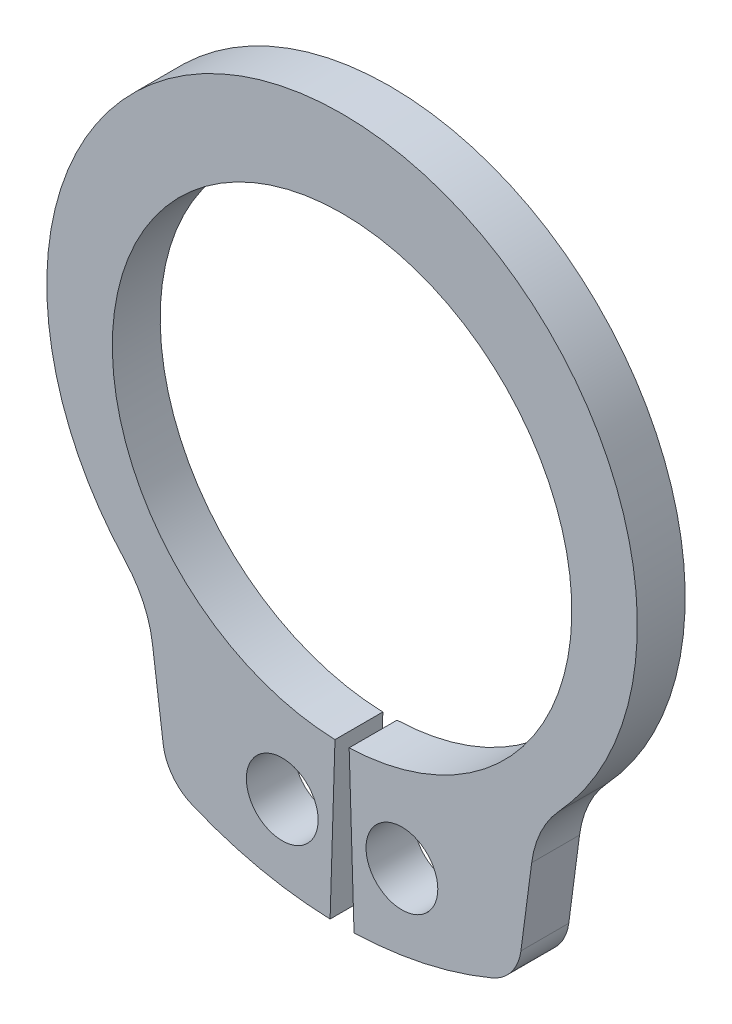
ISO-10303-21;
HEADER;
FILE_DESCRIPTION(('STEP AP214'),'2;1');
FILE_NAME('part.step','',(''),(''),'','','');
FILE_SCHEMA(('AUTOMOTIVE_DESIGN { 1 0 10303 214 1 1 1 1 }'));
ENDSEC;
DATA;
#1=APPLICATION_CONTEXT('core data for automotive mechanical design processes');
#2=APPLICATION_PROTOCOL_DEFINITION('international standard','automotive_design',2000,#1);
#3=PRODUCT_CONTEXT('',#1,'mechanical');
#4=PRODUCT('Part','Part','',(#3));
#5=PRODUCT_RELATED_PRODUCT_CATEGORY('part','',(#4));
#6=PRODUCT_DEFINITION_FORMATION('','',#4);
#7=PRODUCT_DEFINITION_CONTEXT('part definition',#1,'design');
#8=PRODUCT_DEFINITION('design','',#6,#7);
#9=PRODUCT_DEFINITION_SHAPE('','',#8);
#10=(LENGTH_UNIT() NAMED_UNIT(*) SI_UNIT(.MILLI.,.METRE.));
#11=(NAMED_UNIT(*) PLANE_ANGLE_UNIT() SI_UNIT($,.RADIAN.));
#12=(NAMED_UNIT(*) SI_UNIT($,.STERADIAN.) SOLID_ANGLE_UNIT());
#13=UNCERTAINTY_MEASURE_WITH_UNIT(LENGTH_MEASURE(1.E-05),#10,'distance_accuracy_value','');
#14=(GEOMETRIC_REPRESENTATION_CONTEXT(3) GLOBAL_UNCERTAINTY_ASSIGNED_CONTEXT((#13)) GLOBAL_UNIT_ASSIGNED_CONTEXT((#10,
#11,#12)) REPRESENTATION_CONTEXT('',''));
#15=CARTESIAN_POINT('',(0.,0.,0.));
#16=DIRECTION('',(0.,0.,1.));
#17=DIRECTION('',(1.,0.,0.));
#18=AXIS2_PLACEMENT_3D('',#15,#16,#17);
#19=CARTESIAN_POINT('',(0.,0.,-1.));
#20=DIRECTION('',(0.,0.,1.));
#21=DIRECTION('',(1.,0.,0.));
#22=AXIS2_PLACEMENT_3D('',#19,#20,#21);
#23=CYLINDRICAL_SURFACE('',#22,4.8);
#24=CARTESIAN_POINT('',(0.,0.,0.));
#25=DIRECTION('',(0.,0.,-1.));
#26=DIRECTION('',(1.,0.,0.));
#27=AXIS2_PLACEMENT_3D('',#24,#25,#26);
#28=CIRCLE('',#27,4.8);
#29=CARTESIAN_POINT('',(-0.148148148148148,-4.79771321841982,0.));
#30=VERTEX_POINT('',#29);
#31=CARTESIAN_POINT('',(0.148148148148148,-4.79771321841982,0.));
#32=VERTEX_POINT('',#31);
#33=EDGE_CURVE('E153',#30,#32,#28,.T.);
#34=ORIENTED_EDGE('',*,*,#33,.F.);
#35=DIRECTION('',(0.,0.,1.));
#36=VECTOR('',#35,1.);
#37=CARTESIAN_POINT('',(-0.148148148148148,-4.79771321841982,-1.));
#38=LINE('',#37,#36);
#39=CARTESIAN_POINT('',(-0.148148148148148,-4.79771321841982,-1.));
#40=VERTEX_POINT('',#39);
#41=EDGE_CURVE('E11',#40,#30,#38,.T.);
#42=ORIENTED_EDGE('',*,*,#41,.F.);
#43=CARTESIAN_POINT('',(0.,0.,-1.));
#44=DIRECTION('',(0.,0.,-1.));
#45=DIRECTION('',(1.,0.,0.));
#46=AXIS2_PLACEMENT_3D('',#43,#44,#45);
#47=CIRCLE('',#46,4.8);
#48=CARTESIAN_POINT('',(0.148148148148148,-4.79771321841982,-1.));
#49=VERTEX_POINT('',#48);
#50=EDGE_CURVE('E186',#40,#49,#47,.T.);
#51=ORIENTED_EDGE('',*,*,#50,.T.);
#52=DIRECTION('',(0.,0.,1.));
#53=VECTOR('',#52,1.);
#54=CARTESIAN_POINT('',(0.148148148148148,-4.79771321841982,-1.));
#55=LINE('',#54,#53);
#56=EDGE_CURVE('E35',#49,#32,#55,.T.);
#57=ORIENTED_EDGE('',*,*,#56,.T.);
#58=EDGE_LOOP('',(#34,#42,#51,#57));
#59=FACE_BOUND('',#58,.T.);
#60=ADVANCED_FACE('F32',(#59),#23,.F.);
#61=CARTESIAN_POINT('',(-0.148148148148148,-4.79771321841982,-1.));
#62=DIRECTION('',(0.999523587170796,-0.0308641975308642,0.));
#63=DIRECTION('',(0.0308641975308642,0.999523587170796,0.));
#64=AXIS2_PLACEMENT_3D('',#61,#62,#63);
#65=PLANE('',#64);
#66=DIRECTION('',(0.0308641975308642,0.999523587170796,0.));
#67=VECTOR('',#66,1.);
#68=CARTESIAN_POINT('',(-0.148148148148148,-4.79771321841982,0.));
#69=LINE('',#68,#67);
#70=CARTESIAN_POINT('',(-0.25,-8.09614105608345,0.));
#71=VERTEX_POINT('',#70);
#72=EDGE_CURVE('E184',#71,#30,#69,.T.);
#73=ORIENTED_EDGE('',*,*,#72,.F.);
#74=DIRECTION('',(0.,0.,1.));
#75=VECTOR('',#74,1.);
#76=CARTESIAN_POINT('',(-0.25,-8.09614105608345,-1.));
#77=LINE('',#76,#75);
#78=CARTESIAN_POINT('',(-0.25,-8.09614105608345,-1.));
#79=VERTEX_POINT('',#78);
#80=EDGE_CURVE('E41',#79,#71,#77,.T.);
#81=ORIENTED_EDGE('',*,*,#80,.F.);
#82=DIRECTION('',(0.0308641975308642,0.999523587170796,0.));
#83=VECTOR('',#82,1.);
#84=CARTESIAN_POINT('',(-0.148148148148148,-4.79771321841982,-1.));
#85=LINE('',#84,#83);
#86=EDGE_CURVE('E143',#79,#40,#85,.T.);
#87=ORIENTED_EDGE('',*,*,#86,.T.);
#88=ORIENTED_EDGE('',*,*,#41,.T.);
#89=EDGE_LOOP('',(#73,#81,#87,#88));
#90=FACE_BOUND('',#89,.T.);
#91=ADVANCED_FACE('F206',(#90),#65,.T.);
#92=CARTESIAN_POINT('',(0.,0.,-1.));
#93=DIRECTION('',(0.,0.,1.));
#94=DIRECTION('',(1.,0.,0.));
#95=AXIS2_PLACEMENT_3D('',#92,#93,#94);
#96=CYLINDRICAL_SURFACE('',#95,8.1);
#97=CARTESIAN_POINT('',(0.,0.,0.));
#98=DIRECTION('',(0.,0.,1.));
#99=DIRECTION('',(1.,0.,0.));
#100=AXIS2_PLACEMENT_3D('',#97,#98,#99);
#101=CIRCLE('',#100,8.1);
#102=CARTESIAN_POINT('',(-3.13158644156997,-7.47015169584762,0.));
#103=VERTEX_POINT('',#102);
#104=EDGE_CURVE('E130',#103,#71,#101,.T.);
#105=ORIENTED_EDGE('',*,*,#104,.F.);
#106=DIRECTION('',(0.,0.,1.));
#107=VECTOR('',#106,1.);
#108=CARTESIAN_POINT('',(-3.13158644156997,-7.47015169584762,-1.));
#109=LINE('',#108,#107);
#110=CARTESIAN_POINT('',(-3.13158644156997,-7.47015169584762,-1.));
#111=VERTEX_POINT('',#110);
#112=EDGE_CURVE('E125',#111,#103,#109,.T.);
#113=ORIENTED_EDGE('',*,*,#112,.F.);
#114=CARTESIAN_POINT('',(0.,0.,-1.));
#115=DIRECTION('',(0.,0.,1.));
#116=DIRECTION('',(1.,0.,0.));
#117=AXIS2_PLACEMENT_3D('',#114,#115,#116);
#118=CIRCLE('',#117,8.1);
#119=EDGE_CURVE('E128',#111,#79,#118,.T.);
#120=ORIENTED_EDGE('',*,*,#119,.T.);
#121=ORIENTED_EDGE('',*,*,#80,.T.);
#122=EDGE_LOOP('',(#105,#113,#120,#121));
#123=FACE_BOUND('',#122,.T.);
#124=ADVANCED_FACE('F127',(#123),#96,.T.);
#125=CARTESIAN_POINT('',(-2.7449708314996,-6.54791074574298,-1.));
#126=DIRECTION('',(0.,0.,1.));
#127=DIRECTION('',(1.,0.,0.));
#128=AXIS2_PLACEMENT_3D('',#125,#126,#127);
#129=CYLINDRICAL_SURFACE('',#128,1.);
#130=CARTESIAN_POINT('',(-2.7449708314996,-6.54791074574298,0.));
#131=DIRECTION('',(0.,0.,1.));
#132=DIRECTION('',(1.,0.,0.));
#133=AXIS2_PLACEMENT_3D('',#130,#131,#132);
#134=CIRCLE('',#133,1.);
#135=CARTESIAN_POINT('',(-3.73641569287341,-6.67843693796303,0.));
#136=VERTEX_POINT('',#135);
#137=EDGE_CURVE('E181',#136,#103,#134,.T.);
#138=ORIENTED_EDGE('',*,*,#137,.F.);
#139=DIRECTION('',(0.,0.,1.));
#140=VECTOR('',#139,1.);
#141=CARTESIAN_POINT('',(-3.73641569287341,-6.67843693796303,-1.));
#142=LINE('',#141,#140);
#143=CARTESIAN_POINT('',(-3.73641569287341,-6.67843693796303,-1.));
#144=VERTEX_POINT('',#143);
#145=EDGE_CURVE('E135',#144,#136,#142,.T.);
#146=ORIENTED_EDGE('',*,*,#145,.F.);
#147=CARTESIAN_POINT('',(-2.7449708314996,-6.54791074574298,-1.));
#148=DIRECTION('',(0.,0.,1.));
#149=DIRECTION('',(1.,0.,0.));
#150=AXIS2_PLACEMENT_3D('',#147,#148,#149);
#151=CIRCLE('',#150,1.);
#152=EDGE_CURVE('E141',#144,#111,#151,.T.);
#153=ORIENTED_EDGE('',*,*,#152,.T.);
#154=ORIENTED_EDGE('',*,*,#112,.T.);
#155=EDGE_LOOP('',(#138,#146,#153,#154));
#156=FACE_BOUND('',#155,.T.);
#157=ADVANCED_FACE('F145',(#156),#129,.T.);
#158=CARTESIAN_POINT('',(-3.96130985704623,-4.97019616551948,-1.));
#159=DIRECTION('',(-0.99144486137381,-0.130526192220051,0.));
#160=DIRECTION('',(0.130526192220051,-0.991444861373811,0.));
#161=AXIS2_PLACEMENT_3D('',#158,#159,#160);
#162=PLANE('',#161);
#163=DIRECTION('',(0.130526192220051,-0.99144486137381,0.));
#164=VECTOR('',#163,1.);
#165=CARTESIAN_POINT('',(-3.96130985704623,-4.97019616551948,0.));
#166=LINE('',#165,#164);
#167=CARTESIAN_POINT('',(-3.96130985704623,-4.97019616551948,0.));
#168=VERTEX_POINT('',#167);
#169=EDGE_CURVE('E178',#168,#136,#166,.T.);
#170=ORIENTED_EDGE('',*,*,#169,.F.);
#171=DIRECTION('',(0.,0.,1.));
#172=VECTOR('',#171,1.);
#173=CARTESIAN_POINT('',(-3.96130985704623,-4.97019616551948,-1.));
#174=LINE('',#173,#172);
#175=CARTESIAN_POINT('',(-3.96130985704623,-4.97019616551948,-1.));
#176=VERTEX_POINT('',#175);
#177=EDGE_CURVE('E190',#176,#168,#174,.T.);
#178=ORIENTED_EDGE('',*,*,#177,.F.);
#179=DIRECTION('',(0.130526192220051,-0.99144486137381,0.));
#180=VECTOR('',#179,1.);
#181=CARTESIAN_POINT('',(-3.96130985704623,-4.97019616551948,-1.));
#182=LINE('',#181,#180);
#183=EDGE_CURVE('E146',#176,#144,#182,.T.);
#184=ORIENTED_EDGE('',*,*,#183,.T.);
#185=ORIENTED_EDGE('',*,*,#145,.T.);
#186=EDGE_LOOP('',(#170,#178,#184,#185));
#187=FACE_BOUND('',#186,.T.);
#188=ADVANCED_FACE('F219',(#187),#162,.T.);
#189=CARTESIAN_POINT('',(-6.16002808843545,-5.25966291217282,-1.));
#190=DIRECTION('',(0.,0.,1.));
#191=DIRECTION('',(1.,0.,0.));
#192=AXIS2_PLACEMENT_3D('',#189,#190,#191);
#193=CYLINDRICAL_SURFACE('',#192,2.21769088433475);
#194=CARTESIAN_POINT('',(-6.16002808843545,-5.25966291217282,0.));
#195=DIRECTION('',(0.,0.,-1.));
#196=DIRECTION('',(1.,0.,0.));
#197=AXIS2_PLACEMENT_3D('',#194,#195,#196);
#198=CIRCLE('',#197,2.21769088433475);
#199=CARTESIAN_POINT('',(-4.53108492684802,-3.75477187466246,0.));
#200=VERTEX_POINT('',#199);
#201=EDGE_CURVE('E175',#200,#168,#198,.T.);
#202=ORIENTED_EDGE('',*,*,#201,.F.);
#203=DIRECTION('',(0.,0.,1.));
#204=VECTOR('',#203,1.);
#205=CARTESIAN_POINT('',(-4.53108492684802,-3.75477187466246,-1.));
#206=LINE('',#205,#204);
#207=CARTESIAN_POINT('',(-4.53108492684802,-3.75477187466246,-1.));
#208=VERTEX_POINT('',#207);
#209=EDGE_CURVE('E192',#208,#200,#206,.T.);
#210=ORIENTED_EDGE('',*,*,#209,.F.);
#211=CARTESIAN_POINT('',(-6.16002808843545,-5.25966291217282,-1.));
#212=DIRECTION('',(0.,0.,-1.));
#213=DIRECTION('',(1.,0.,0.));
#214=AXIS2_PLACEMENT_3D('',#211,#212,#213);
#215=CIRCLE('',#214,2.21769088433475);
#216=EDGE_CURVE('E148',#208,#176,#215,.T.);
#217=ORIENTED_EDGE('',*,*,#216,.T.);
#218=ORIENTED_EDGE('',*,*,#177,.T.);
#219=EDGE_LOOP('',(#202,#210,#217,#218));
#220=FACE_BOUND('',#219,.T.);
#221=ADVANCED_FACE('F222',(#220),#193,.F.);
#222=CARTESIAN_POINT('',(0.,0.431248397503952,-1.));
#223=DIRECTION('',(0.,0.,1.));
#224=DIRECTION('',(1.,0.,0.));
#225=AXIS2_PLACEMENT_3D('',#222,#223,#224);
#226=CYLINDRICAL_SURFACE('',#225,6.16875160249605);
#227=CARTESIAN_POINT('',(0.,0.431248397503952,0.));
#228=DIRECTION('',(0.,0.,1.));
#229=DIRECTION('',(1.,0.,0.));
#230=AXIS2_PLACEMENT_3D('',#227,#228,#229);
#231=CIRCLE('',#230,6.16875160249605);
#232=CARTESIAN_POINT('',(4.53108492684802,-3.75477187466247,0.));
#233=VERTEX_POINT('',#232);
#234=EDGE_CURVE('E172',#233,#200,#231,.T.);
#235=ORIENTED_EDGE('',*,*,#234,.F.);
#236=DIRECTION('',(0.,0.,1.));
#237=VECTOR('',#236,1.);
#238=CARTESIAN_POINT('',(4.53108492684802,-3.75477187466247,-1.));
#239=LINE('',#238,#237);
#240=CARTESIAN_POINT('',(4.53108492684802,-3.75477187466247,-1.));
#241=VERTEX_POINT('',#240);
#242=EDGE_CURVE('E194',#241,#233,#239,.T.);
#243=ORIENTED_EDGE('',*,*,#242,.F.);
#244=CARTESIAN_POINT('',(0.,0.431248397503952,-1.));
#245=DIRECTION('',(0.,0.,1.));
#246=DIRECTION('',(1.,0.,0.));
#247=AXIS2_PLACEMENT_3D('',#244,#245,#246);
#248=CIRCLE('',#247,6.16875160249605);
#249=EDGE_CURVE('E296',#241,#208,#248,.T.);
#250=ORIENTED_EDGE('',*,*,#249,.T.);
#251=ORIENTED_EDGE('',*,*,#209,.T.);
#252=EDGE_LOOP('',(#235,#243,#250,#251));
#253=FACE_BOUND('',#252,.T.);
#254=ADVANCED_FACE('F226',(#253),#226,.T.);
#255=CARTESIAN_POINT('',(6.16002808843545,-5.25966291217282,-1.));
#256=DIRECTION('',(0.,0.,1.));
#257=DIRECTION('',(1.,0.,0.));
#258=AXIS2_PLACEMENT_3D('',#255,#256,#257);
#259=CYLINDRICAL_SURFACE('',#258,2.21769088433475);
#260=CARTESIAN_POINT('',(6.16002808843545,-5.25966291217282,0.));
#261=DIRECTION('',(0.,0.,-1.));
#262=DIRECTION('',(1.,0.,0.));
#263=AXIS2_PLACEMENT_3D('',#260,#261,#262);
#264=CIRCLE('',#263,2.21769088433475);
#265=CARTESIAN_POINT('',(3.96130985704623,-4.97019616551948,0.));
#266=VERTEX_POINT('',#265);
#267=EDGE_CURVE('E169',#266,#233,#264,.T.);
#268=ORIENTED_EDGE('',*,*,#267,.F.);
#269=DIRECTION('',(0.,0.,1.));
#270=VECTOR('',#269,1.);
#271=CARTESIAN_POINT('',(3.96130985704623,-4.97019616551948,-1.));
#272=LINE('',#271,#270);
#273=CARTESIAN_POINT('',(3.96130985704623,-4.97019616551948,-1.));
#274=VERTEX_POINT('',#273);
#275=EDGE_CURVE('E196',#274,#266,#272,.T.);
#276=ORIENTED_EDGE('',*,*,#275,.F.);
#277=CARTESIAN_POINT('',(6.16002808843545,-5.25966291217282,-1.));
#278=DIRECTION('',(0.,0.,-1.));
#279=DIRECTION('',(1.,0.,0.));
#280=AXIS2_PLACEMENT_3D('',#277,#278,#279);
#281=CIRCLE('',#280,2.21769088433475);
#282=EDGE_CURVE('E293',#274,#241,#281,.T.);
#283=ORIENTED_EDGE('',*,*,#282,.T.);
#284=ORIENTED_EDGE('',*,*,#242,.T.);
#285=EDGE_LOOP('',(#268,#276,#283,#284));
#286=FACE_BOUND('',#285,.T.);
#287=ADVANCED_FACE('F230',(#286),#259,.F.);
#288=CARTESIAN_POINT('',(3.96130985704623,-4.97019616551948,-1.));
#289=DIRECTION('',(0.99144486137381,-0.130526192220051,0.));
#290=DIRECTION('',(0.130526192220051,0.991444861373811,0.));
#291=AXIS2_PLACEMENT_3D('',#288,#289,#290);
#292=PLANE('',#291);
#293=DIRECTION('',(0.130526192220051,0.99144486137381,0.));
#294=VECTOR('',#293,1.);
#295=CARTESIAN_POINT('',(3.96130985704623,-4.97019616551948,0.));
#296=LINE('',#295,#294);
#297=CARTESIAN_POINT('',(3.73641569287341,-6.67843693796303,0.));
#298=VERTEX_POINT('',#297);
#299=EDGE_CURVE('E166',#298,#266,#296,.T.);
#300=ORIENTED_EDGE('',*,*,#299,.F.);
#301=DIRECTION('',(0.,0.,1.));
#302=VECTOR('',#301,1.);
#303=CARTESIAN_POINT('',(3.73641569287341,-6.67843693796303,-1.));
#304=LINE('',#303,#302);
#305=CARTESIAN_POINT('',(3.73641569287341,-6.67843693796303,-1.));
#306=VERTEX_POINT('',#305);
#307=EDGE_CURVE('E198',#306,#298,#304,.T.);
#308=ORIENTED_EDGE('',*,*,#307,.F.);
#309=DIRECTION('',(0.130526192220051,0.99144486137381,0.));
#310=VECTOR('',#309,1.);
#311=CARTESIAN_POINT('',(3.96130985704623,-4.97019616551948,-1.));
#312=LINE('',#311,#310);
#313=EDGE_CURVE('E290',#306,#274,#312,.T.);
#314=ORIENTED_EDGE('',*,*,#313,.T.);
#315=ORIENTED_EDGE('',*,*,#275,.T.);
#316=EDGE_LOOP('',(#300,#308,#314,#315));
#317=FACE_BOUND('',#316,.T.);
#318=ADVANCED_FACE('F234',(#317),#292,.T.);
#319=CARTESIAN_POINT('',(2.7449708314996,-6.54791074574298,-1.));
#320=DIRECTION('',(0.,0.,1.));
#321=DIRECTION('',(1.,0.,0.));
#322=AXIS2_PLACEMENT_3D('',#319,#320,#321);
#323=CYLINDRICAL_SURFACE('',#322,1.);
#324=CARTESIAN_POINT('',(2.7449708314996,-6.54791074574298,0.));
#325=DIRECTION('',(0.,0.,1.));
#326=DIRECTION('',(-1.,0.,0.));
#327=AXIS2_PLACEMENT_3D('',#324,#325,#326);
#328=CIRCLE('',#327,1.);
#329=CARTESIAN_POINT('',(3.13158644156997,-7.47015169584763,0.));
#330=VERTEX_POINT('',#329);
#331=EDGE_CURVE('E163',#330,#298,#328,.T.);
#332=ORIENTED_EDGE('',*,*,#331,.F.);
#333=DIRECTION('',(0.,0.,1.));
#334=VECTOR('',#333,1.);
#335=CARTESIAN_POINT('',(3.13158644156997,-7.47015169584763,-1.));
#336=LINE('',#335,#334);
#337=CARTESIAN_POINT('',(3.13158644156997,-7.47015169584763,-1.));
#338=VERTEX_POINT('',#337);
#339=EDGE_CURVE('E200',#338,#330,#336,.T.);
#340=ORIENTED_EDGE('',*,*,#339,.F.);
#341=CARTESIAN_POINT('',(2.7449708314996,-6.54791074574298,-1.));
#342=DIRECTION('',(0.,0.,1.));
#343=DIRECTION('',(-1.,0.,0.));
#344=AXIS2_PLACEMENT_3D('',#341,#342,#343);
#345=CIRCLE('',#344,1.);
#346=EDGE_CURVE('E287',#338,#306,#345,.T.);
#347=ORIENTED_EDGE('',*,*,#346,.T.);
#348=ORIENTED_EDGE('',*,*,#307,.T.);
#349=EDGE_LOOP('',(#332,#340,#347,#348));
#350=FACE_BOUND('',#349,.T.);
#351=ADVANCED_FACE('F238',(#350),#323,.T.);
#352=CARTESIAN_POINT('',(0.,0.,-1.));
#353=DIRECTION('',(0.,0.,1.));
#354=DIRECTION('',(1.,0.,0.));
#355=AXIS2_PLACEMENT_3D('',#352,#353,#354);
#356=CYLINDRICAL_SURFACE('',#355,8.1);
#357=CARTESIAN_POINT('',(0.,0.,0.));
#358=DIRECTION('',(0.,0.,1.));
#359=DIRECTION('',(1.,0.,0.));
#360=AXIS2_PLACEMENT_3D('',#357,#358,#359);
#361=CIRCLE('',#360,8.1);
#362=CARTESIAN_POINT('',(0.249999999999997,-8.09614105608345,0.));
#363=VERTEX_POINT('',#362);
#364=EDGE_CURVE('E160',#363,#330,#361,.T.);
#365=ORIENTED_EDGE('',*,*,#364,.F.);
#366=DIRECTION('',(0.,0.,1.));
#367=VECTOR('',#366,1.);
#368=CARTESIAN_POINT('',(0.249999999999997,-8.09614105608345,-1.));
#369=LINE('',#368,#367);
#370=CARTESIAN_POINT('',(0.249999999999997,-8.09614105608345,-1.));
#371=VERTEX_POINT('',#370);
#372=EDGE_CURVE('E201',#371,#363,#369,.T.);
#373=ORIENTED_EDGE('',*,*,#372,.F.);
#374=CARTESIAN_POINT('',(0.,0.,-1.));
#375=DIRECTION('',(0.,0.,1.));
#376=DIRECTION('',(1.,0.,0.));
#377=AXIS2_PLACEMENT_3D('',#374,#375,#376);
#378=CIRCLE('',#377,8.1);
#379=EDGE_CURVE('E284',#371,#338,#378,.T.);
#380=ORIENTED_EDGE('',*,*,#379,.T.);
#381=ORIENTED_EDGE('',*,*,#339,.T.);
#382=EDGE_LOOP('',(#365,#373,#380,#381));
#383=FACE_BOUND('',#382,.T.);
#384=ADVANCED_FACE('F242',(#383),#356,.T.);
#385=CARTESIAN_POINT('',(0.148148148148148,-4.79771321841982,-1.));
#386=DIRECTION('',(-0.999523587170796,-0.0308641975308642,0.));
#387=DIRECTION('',(0.0308641975308642,-0.999523587170796,0.));
#388=AXIS2_PLACEMENT_3D('',#385,#386,#387);
#389=PLANE('',#388);
#390=DIRECTION('',(0.0308641975308642,-0.999523587170796,0.));
#391=VECTOR('',#390,1.);
#392=CARTESIAN_POINT('',(0.148148148148148,-4.79771321841982,0.));
#393=LINE('',#392,#391);
#394=EDGE_CURVE('E156',#32,#363,#393,.T.);
#395=ORIENTED_EDGE('',*,*,#394,.F.);
#396=ORIENTED_EDGE('',*,*,#56,.F.);
#397=DIRECTION('',(0.0308641975308642,-0.999523587170796,0.));
#398=VECTOR('',#397,1.);
#399=CARTESIAN_POINT('',(0.148148148148148,-4.79771321841982,-1.));
#400=LINE('',#399,#398);
#401=EDGE_CURVE('E282',#49,#371,#400,.T.);
#402=ORIENTED_EDGE('',*,*,#401,.T.);
#403=ORIENTED_EDGE('',*,*,#372,.T.);
#404=EDGE_LOOP('',(#395,#396,#402,#403));
#405=FACE_BOUND('',#404,.T.);
#406=ADVANCED_FACE('F203',(#405),#389,.T.);
#407=CARTESIAN_POINT('',(0.,0.,-1.));
#408=DIRECTION('',(0.,0.,1.));
#409=DIRECTION('',(1.,0.,0.));
#410=AXIS2_PLACEMENT_3D('',#407,#408,#409);
#411=PLANE('',#410);
#412=CARTESIAN_POINT('',(-1.25,-6.4296189622714,-1.));
#413=DIRECTION('',(0.,0.,1.));
#414=DIRECTION('',(1.,0.,0.));
#415=AXIS2_PLACEMENT_3D('',#412,#413,#414);
#416=CIRCLE('',#415,0.75);
#417=CARTESIAN_POINT('',(-0.5,-6.4296189622714,-1.));
#418=VERTEX_POINT('',#417);
#419=EDGE_CURVE('E269',#418,#418,#416,.T.);
#420=ORIENTED_EDGE('',*,*,#419,.T.);
#421=EDGE_LOOP('',(#420));
#422=FACE_BOUND('',#421,.T.);
#423=CARTESIAN_POINT('',(1.25,-6.4296189622714,-1.));
#424=DIRECTION('',(0.,0.,1.));
#425=DIRECTION('',(1.,0.,0.));
#426=AXIS2_PLACEMENT_3D('',#423,#424,#425);
#427=CIRCLE('',#426,0.75);
#428=CARTESIAN_POINT('',(2.,-6.4296189622714,-1.));
#429=VERTEX_POINT('',#428);
#430=EDGE_CURVE('E157',#429,#429,#427,.T.);
#431=ORIENTED_EDGE('',*,*,#430,.T.);
#432=EDGE_LOOP('',(#431));
#433=FACE_BOUND('',#432,.T.);
#434=ORIENTED_EDGE('',*,*,#50,.F.);
#435=ORIENTED_EDGE('',*,*,#86,.F.);
#436=ORIENTED_EDGE('',*,*,#119,.F.);
#437=ORIENTED_EDGE('',*,*,#152,.F.);
#438=ORIENTED_EDGE('',*,*,#183,.F.);
#439=ORIENTED_EDGE('',*,*,#216,.F.);
#440=ORIENTED_EDGE('',*,*,#249,.F.);
#441=ORIENTED_EDGE('',*,*,#282,.F.);
#442=ORIENTED_EDGE('',*,*,#313,.F.);
#443=ORIENTED_EDGE('',*,*,#346,.F.);
#444=ORIENTED_EDGE('',*,*,#379,.F.);
#445=ORIENTED_EDGE('',*,*,#401,.F.);
#446=EDGE_LOOP('',(#434,#435,#436,#437,#438,#439,#440,#441,#442,#443,#444,#445));
#447=FACE_BOUND('',#446,.T.);
#448=ADVANCED_FACE('F139',(#422,#433,#447),#411,.F.);
#449=CARTESIAN_POINT('',(0.,0.,0.));
#450=DIRECTION('',(0.,0.,1.));
#451=DIRECTION('',(1.,0.,0.));
#452=AXIS2_PLACEMENT_3D('',#449,#450,#451);
#453=PLANE('',#452);
#454=CARTESIAN_POINT('',(-1.25,-6.4296189622714,0.));
#455=DIRECTION('',(0.,0.,1.));
#456=DIRECTION('',(1.,0.,0.));
#457=AXIS2_PLACEMENT_3D('',#454,#455,#456);
#458=CIRCLE('',#457,0.75);
#459=CARTESIAN_POINT('',(-0.5,-6.4296189622714,0.));
#460=VERTEX_POINT('',#459);
#461=EDGE_CURVE('E272',#460,#460,#458,.T.);
#462=ORIENTED_EDGE('',*,*,#461,.F.);
#463=EDGE_LOOP('',(#462));
#464=FACE_BOUND('',#463,.T.);
#465=CARTESIAN_POINT('',(1.25,-6.4296189622714,0.));
#466=DIRECTION('',(0.,0.,1.));
#467=DIRECTION('',(1.,0.,0.));
#468=AXIS2_PLACEMENT_3D('',#465,#466,#467);
#469=CIRCLE('',#468,0.75);
#470=CARTESIAN_POINT('',(2.,-6.4296189622714,0.));
#471=VERTEX_POINT('',#470);
#472=EDGE_CURVE('E274',#471,#471,#469,.T.);
#473=ORIENTED_EDGE('',*,*,#472,.F.);
#474=EDGE_LOOP('',(#473));
#475=FACE_BOUND('',#474,.T.);
#476=ORIENTED_EDGE('',*,*,#33,.T.);
#477=ORIENTED_EDGE('',*,*,#394,.T.);
#478=ORIENTED_EDGE('',*,*,#364,.T.);
#479=ORIENTED_EDGE('',*,*,#331,.T.);
#480=ORIENTED_EDGE('',*,*,#299,.T.);
#481=ORIENTED_EDGE('',*,*,#267,.T.);
#482=ORIENTED_EDGE('',*,*,#234,.T.);
#483=ORIENTED_EDGE('',*,*,#201,.T.);
#484=ORIENTED_EDGE('',*,*,#169,.T.);
#485=ORIENTED_EDGE('',*,*,#137,.T.);
#486=ORIENTED_EDGE('',*,*,#104,.T.);
#487=ORIENTED_EDGE('',*,*,#72,.T.);
#488=EDGE_LOOP('',(#476,#477,#478,#479,#480,#481,#482,#483,#484,#485,#486,#487));
#489=FACE_BOUND('',#488,.T.);
#490=ADVANCED_FACE('F205',(#464,#475,#489),#453,.T.);
#491=CARTESIAN_POINT('',(1.25,-6.4296189622714,-1.));
#492=DIRECTION('',(0.,0.,1.));
#493=DIRECTION('',(1.,0.,0.));
#494=AXIS2_PLACEMENT_3D('',#491,#492,#493);
#495=CYLINDRICAL_SURFACE('',#494,0.75);
#496=ORIENTED_EDGE('',*,*,#430,.F.);
#497=EDGE_LOOP('',(#496));
#498=FACE_BOUND('',#497,.T.);
#499=ORIENTED_EDGE('',*,*,#472,.T.);
#500=EDGE_LOOP('',(#499));
#501=FACE_BOUND('',#500,.T.);
#502=ADVANCED_FACE('F254',(#498,#501),#495,.F.);
#503=CARTESIAN_POINT('',(-1.25,-6.4296189622714,-1.));
#504=DIRECTION('',(0.,0.,1.));
#505=DIRECTION('',(1.,0.,0.));
#506=AXIS2_PLACEMENT_3D('',#503,#504,#505);
#507=CYLINDRICAL_SURFACE('',#506,0.75);
#508=ORIENTED_EDGE('',*,*,#419,.F.);
#509=EDGE_LOOP('',(#508));
#510=FACE_BOUND('',#509,.T.);
#511=ORIENTED_EDGE('',*,*,#461,.T.);
#512=EDGE_LOOP('',(#511));
#513=FACE_BOUND('',#512,.T.);
#514=ADVANCED_FACE('F261',(#510,#513),#507,.F.);
#515=CLOSED_SHELL('',(#60,#91,#124,#157,#188,#221,#254,#287,#318,#351,#384,#406,#448,#490,#502,#514));
#516=MANIFOLD_SOLID_BREP('B2',#515);
#517=ADVANCED_BREP_SHAPE_REPRESENTATION('',(#18,#516),#14);
#518=SHAPE_DEFINITION_REPRESENTATION(#9,#517);
ENDSEC;
END-ISO-10303-21;
